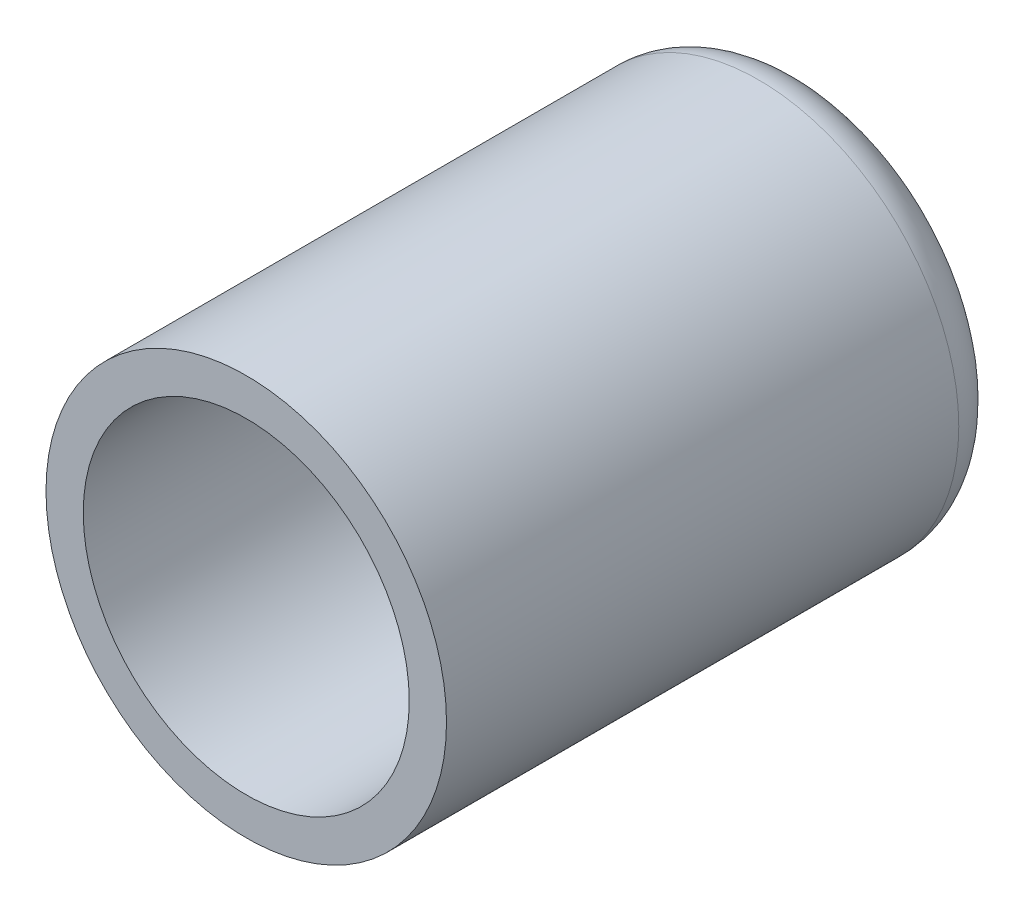
ISO-10303-21;
HEADER;
FILE_DESCRIPTION(('STEP AP214'),'2;1');
FILE_NAME('part.step','',(''),(''),'','','');
FILE_SCHEMA(('AUTOMOTIVE_DESIGN { 1 0 10303 214 1 1 1 1 }'));
ENDSEC;
DATA;
#1=APPLICATION_CONTEXT('core data for automotive mechanical design processes');
#2=APPLICATION_PROTOCOL_DEFINITION('international standard','automotive_design',2000,#1);
#3=PRODUCT_CONTEXT('',#1,'mechanical');
#4=PRODUCT('Part','Part','',(#3));
#5=PRODUCT_RELATED_PRODUCT_CATEGORY('part','',(#4));
#6=PRODUCT_DEFINITION_FORMATION('','',#4);
#7=PRODUCT_DEFINITION_CONTEXT('part definition',#1,'design');
#8=PRODUCT_DEFINITION('design','',#6,#7);
#9=PRODUCT_DEFINITION_SHAPE('','',#8);
#10=(LENGTH_UNIT() NAMED_UNIT(*) SI_UNIT(.MILLI.,.METRE.));
#11=(NAMED_UNIT(*) PLANE_ANGLE_UNIT() SI_UNIT($,.RADIAN.));
#12=(NAMED_UNIT(*) SI_UNIT($,.STERADIAN.) SOLID_ANGLE_UNIT());
#13=UNCERTAINTY_MEASURE_WITH_UNIT(LENGTH_MEASURE(1.E-05),#10,'distance_accuracy_value','');
#14=(GEOMETRIC_REPRESENTATION_CONTEXT(3) GLOBAL_UNCERTAINTY_ASSIGNED_CONTEXT((#13)) GLOBAL_UNIT_ASSIGNED_CONTEXT((#10,
#11,#12)) REPRESENTATION_CONTEXT('',''));
#15=CARTESIAN_POINT('',(0.,0.,0.));
#16=DIRECTION('',(0.,0.,1.));
#17=DIRECTION('',(1.,0.,0.));
#18=AXIS2_PLACEMENT_3D('',#15,#16,#17);
#19=CARTESIAN_POINT('',(0.,0.,6.));
#20=DIRECTION('',(0.,0.,-1.));
#21=DIRECTION('',(-1.,0.,0.));
#22=AXIS2_PLACEMENT_3D('',#19,#20,#21);
#23=CYLINDRICAL_SURFACE('',#22,2.15);
#24=CARTESIAN_POINT('',(0.,0.,0.5));
#25=DIRECTION('',(0.,0.,1.));
#26=DIRECTION('',(1.,0.,0.));
#27=AXIS2_PLACEMENT_3D('',#24,#25,#26);
#28=CIRCLE('',#27,2.15);
#29=CARTESIAN_POINT('',(2.15,0.,0.5));
#30=VERTEX_POINT('',#29);
#31=EDGE_CURVE('E38',#30,#30,#28,.T.);
#32=ORIENTED_EDGE('',*,*,#31,.T.);
#33=EDGE_LOOP('',(#32));
#34=FACE_BOUND('',#33,.T.);
#35=CARTESIAN_POINT('',(0.,0.,6.));
#36=DIRECTION('',(0.,0.,1.));
#37=DIRECTION('',(1.,0.,0.));
#38=AXIS2_PLACEMENT_3D('',#35,#36,#37);
#39=CIRCLE('',#38,2.15);
#40=CARTESIAN_POINT('',(2.15,0.,6.));
#41=VERTEX_POINT('',#40);
#42=EDGE_CURVE('E42',#41,#41,#39,.T.);
#43=ORIENTED_EDGE('',*,*,#42,.F.);
#44=EDGE_LOOP('',(#43));
#45=FACE_BOUND('',#44,.T.);
#46=ADVANCED_FACE('F31',(#34,#45),#23,.T.);
#47=CARTESIAN_POINT('',(0.,0.,6.));
#48=DIRECTION('',(0.,0.,1.));
#49=DIRECTION('',(1.,0.,0.));
#50=AXIS2_PLACEMENT_3D('',#47,#48,#49);
#51=PLANE('',#50);
#52=CARTESIAN_POINT('',(0.,0.,6.));
#53=DIRECTION('',(0.,0.,1.));
#54=DIRECTION('',(1.,0.,0.));
#55=AXIS2_PLACEMENT_3D('',#52,#53,#54);
#56=CIRCLE('',#55,1.75);
#57=CARTESIAN_POINT('',(1.75,0.,6.));
#58=VERTEX_POINT('',#57);
#59=EDGE_CURVE('E49',#58,#58,#56,.T.);
#60=ORIENTED_EDGE('',*,*,#59,.F.);
#61=EDGE_LOOP('',(#60));
#62=FACE_BOUND('',#61,.T.);
#63=ORIENTED_EDGE('',*,*,#42,.T.);
#64=EDGE_LOOP('',(#63));
#65=FACE_BOUND('',#64,.T.);
#66=ADVANCED_FACE('F64',(#62,#65),#51,.T.);
#67=CARTESIAN_POINT('',(0.,0.,0.));
#68=DIRECTION('',(0.,0.,1.));
#69=DIRECTION('',(1.,0.,0.));
#70=AXIS2_PLACEMENT_3D('',#67,#68,#69);
#71=PLANE('',#70);
#72=CARTESIAN_POINT('',(0.,0.,0.));
#73=DIRECTION('',(0.,0.,1.));
#74=DIRECTION('',(1.,0.,0.));
#75=AXIS2_PLACEMENT_3D('',#72,#73,#74);
#76=CIRCLE('',#75,1.65);
#77=CARTESIAN_POINT('',(1.65,0.,0.));
#78=VERTEX_POINT('',#77);
#79=EDGE_CURVE('E10',#78,#78,#76,.F.);
#80=ORIENTED_EDGE('',*,*,#79,.T.);
#81=EDGE_LOOP('',(#80));
#82=FACE_BOUND('',#81,.T.);
#83=ADVANCED_FACE('F60',(#82),#71,.F.);
#84=CARTESIAN_POINT('',(0.,0.,0.5));
#85=DIRECTION('',(0.,0.,1.));
#86=DIRECTION('',(1.,0.,0.));
#87=AXIS2_PLACEMENT_3D('',#84,#85,#86);
#88=CYLINDRICAL_SURFACE('',#87,1.75);
#89=CARTESIAN_POINT('',(0.,0.,0.5));
#90=DIRECTION('',(0.,0.,1.));
#91=DIRECTION('',(1.,0.,0.));
#92=AXIS2_PLACEMENT_3D('',#89,#90,#91);
#93=CIRCLE('',#92,1.75);
#94=CARTESIAN_POINT('',(1.75,0.,0.5));
#95=VERTEX_POINT('',#94);
#96=EDGE_CURVE('E46',#95,#95,#93,.T.);
#97=ORIENTED_EDGE('',*,*,#96,.F.);
#98=EDGE_LOOP('',(#97));
#99=FACE_BOUND('',#98,.T.);
#100=ORIENTED_EDGE('',*,*,#59,.T.);
#101=EDGE_LOOP('',(#100));
#102=FACE_BOUND('',#101,.T.);
#103=ADVANCED_FACE('F57',(#99,#102),#88,.F.);
#104=CARTESIAN_POINT('',(0.,0.,0.5));
#105=DIRECTION('',(0.,0.,1.));
#106=DIRECTION('',(1.,0.,0.));
#107=AXIS2_PLACEMENT_3D('',#104,#105,#106);
#108=PLANE('',#107);
#109=ORIENTED_EDGE('',*,*,#96,.T.);
#110=EDGE_LOOP('',(#109));
#111=FACE_BOUND('',#110,.T.);
#112=ADVANCED_FACE('F55',(#111),#108,.T.);
#113=CARTESIAN_POINT('',(0.,0.,0.5));
#114=DIRECTION('',(0.,0.,1.));
#115=DIRECTION('',(1.,0.,0.));
#116=AXIS2_PLACEMENT_3D('',#113,#114,#115);
#117=TOROIDAL_SURFACE('',#116,1.65,0.5);
#118=ORIENTED_EDGE('',*,*,#79,.F.);
#119=EDGE_LOOP('',(#118));
#120=FACE_BOUND('',#119,.T.);
#121=ORIENTED_EDGE('',*,*,#31,.F.);
#122=EDGE_LOOP('',(#121));
#123=FACE_BOUND('',#122,.T.);
#124=ADVANCED_FACE('F33',(#120,#123),#117,.T.);
#125=CLOSED_SHELL('',(#46,#66,#83,#103,#112,#124));
#126=MANIFOLD_SOLID_BREP('B2',#125);
#127=ADVANCED_BREP_SHAPE_REPRESENTATION('',(#18,#126),#14);
#128=SHAPE_DEFINITION_REPRESENTATION(#9,#127);
ENDSEC;
END-ISO-10303-21;
